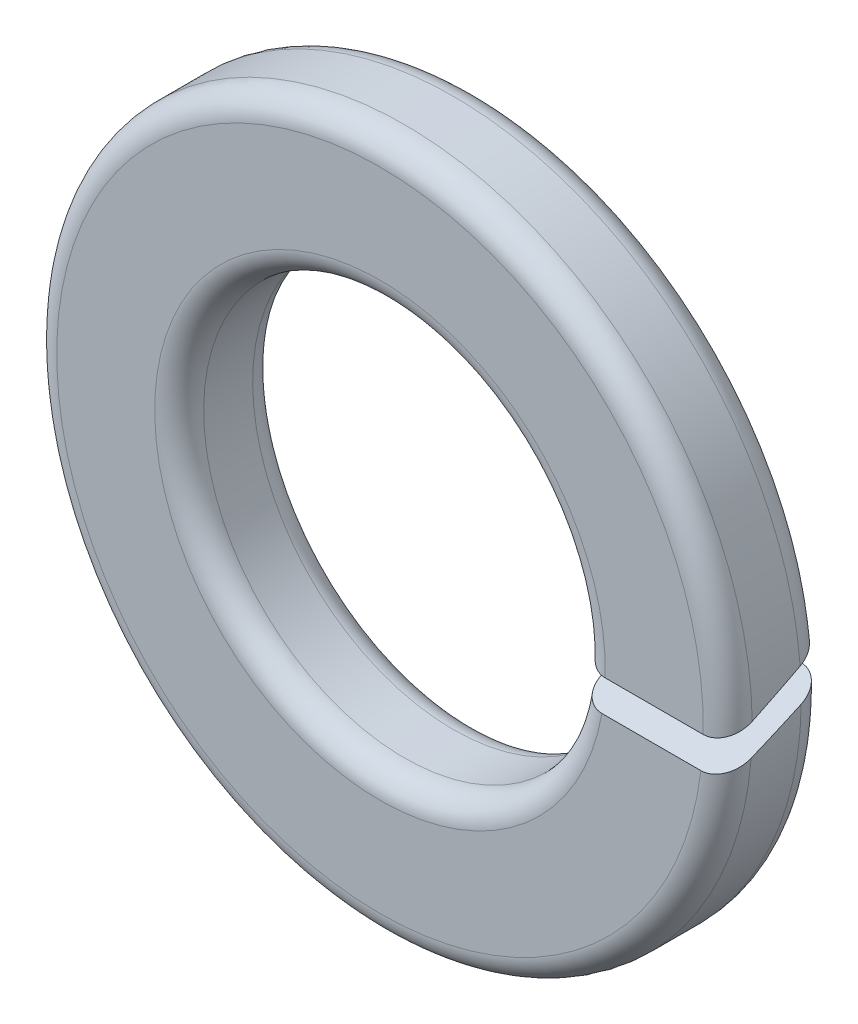
ISO-10303-21;
HEADER;
FILE_DESCRIPTION(('STEP AP214'),'2;1');
FILE_NAME('part.step','',(''),(''),'','','');
FILE_SCHEMA(('AUTOMOTIVE_DESIGN { 1 0 10303 214 1 1 1 1 }'));
ENDSEC;
DATA;
#1=APPLICATION_CONTEXT('core data for automotive mechanical design processes');
#2=APPLICATION_PROTOCOL_DEFINITION('international standard','automotive_design',2000,#1);
#3=PRODUCT_CONTEXT('',#1,'mechanical');
#4=PRODUCT('Part','Part','',(#3));
#5=PRODUCT_RELATED_PRODUCT_CATEGORY('part','',(#4));
#6=PRODUCT_DEFINITION_FORMATION('','',#4);
#7=PRODUCT_DEFINITION_CONTEXT('part definition',#1,'design');
#8=PRODUCT_DEFINITION('design','',#6,#7);
#9=PRODUCT_DEFINITION_SHAPE('','',#8);
#10=(LENGTH_UNIT() NAMED_UNIT(*) SI_UNIT(.MILLI.,.METRE.));
#11=(NAMED_UNIT(*) PLANE_ANGLE_UNIT() SI_UNIT($,.RADIAN.));
#12=(NAMED_UNIT(*) SI_UNIT($,.STERADIAN.) SOLID_ANGLE_UNIT());
#13=UNCERTAINTY_MEASURE_WITH_UNIT(LENGTH_MEASURE(1.E-05),#10,'distance_accuracy_value','');
#14=(GEOMETRIC_REPRESENTATION_CONTEXT(3) GLOBAL_UNCERTAINTY_ASSIGNED_CONTEXT((#13)) GLOBAL_UNIT_ASSIGNED_CONTEXT((#10,
#11,#12)) REPRESENTATION_CONTEXT('',''));
#15=CARTESIAN_POINT('',(0.,0.,0.));
#16=DIRECTION('',(0.,0.,1.));
#17=DIRECTION('',(1.,0.,0.));
#18=AXIS2_PLACEMENT_3D('',#15,#16,#17);
#19=CARTESIAN_POINT('',(0.,0.,2.));
#20=DIRECTION('',(0.,0.,1.));
#21=DIRECTION('',(1.,0.,0.));
#22=AXIS2_PLACEMENT_3D('',#19,#20,#21);
#23=PLANE('',#22);
#24=CARTESIAN_POINT('',(0.,0.,2.));
#25=DIRECTION('',(0.,0.,1.));
#26=DIRECTION('',(1.,0.,0.));
#27=AXIS2_PLACEMENT_3D('',#24,#25,#26);
#28=CIRCLE('',#27,4.6);
#29=CARTESIAN_POINT('',(4.53037296135653,-0.797321033843752,2.));
#30=VERTEX_POINT('',#29);
#31=CARTESIAN_POINT('',(4.5980099453059,-0.135294282466256,2.));
#32=VERTEX_POINT('',#31);
#33=EDGE_CURVE('E115',#30,#32,#28,.F.);
#34=ORIENTED_EDGE('',*,*,#33,.T.);
#35=DIRECTION('',(-1.,0.,0.));
#36=VECTOR('',#35,1.);
#37=CARTESIAN_POINT('',(7.1,-0.135294282466256,2.));
#38=LINE('',#37,#36);
#39=CARTESIAN_POINT('',(6.59861314649767,-0.135294282466256,2.));
#40=VERTEX_POINT('',#39);
#41=EDGE_CURVE('E198',#40,#32,#38,.T.);
#42=ORIENTED_EDGE('',*,*,#41,.F.);
#43=CARTESIAN_POINT('',(0.,0.,2.));
#44=DIRECTION('',(0.,0.,1.));
#45=DIRECTION('',(1.,0.,0.));
#46=AXIS2_PLACEMENT_3D('',#43,#44,#45);
#47=CIRCLE('',#46,6.6);
#48=CARTESIAN_POINT('',(6.5516623210446,-0.797321033843752,2.));
#49=VERTEX_POINT('',#48);
#50=EDGE_CURVE('E120',#40,#49,#47,.T.);
#51=ORIENTED_EDGE('',*,*,#50,.T.);
#52=DIRECTION('',(-1.,0.,0.));
#53=VECTOR('',#52,1.);
#54=CARTESIAN_POINT('',(7.1,-0.797321033843752,2.));
#55=LINE('',#54,#53);
#56=EDGE_CURVE('E112',#49,#30,#55,.T.);
#57=ORIENTED_EDGE('',*,*,#56,.T.);
#58=EDGE_LOOP('',(#34,#42,#51,#57));
#59=FACE_BOUND('',#58,.T.);
#60=ADVANCED_FACE('F30',(#59),#23,.T.);
#61=CARTESIAN_POINT('',(0.,0.,0.));
#62=DIRECTION('',(0.,0.,1.));
#63=DIRECTION('',(1.,0.,0.));
#64=AXIS2_PLACEMENT_3D('',#61,#62,#63);
#65=PLANE('',#64);
#66=DIRECTION('',(-1.,0.,0.));
#67=VECTOR('',#66,1.);
#68=CARTESIAN_POINT('',(7.1,0.797321033843752,0.));
#69=LINE('',#68,#67);
#70=CARTESIAN_POINT('',(6.5516623210442,0.797321033843752,0.));
#71=VERTEX_POINT('',#70);
#72=CARTESIAN_POINT('',(4.53037296135653,0.797321033843752,0.));
#73=VERTEX_POINT('',#72);
#74=EDGE_CURVE('E58',#71,#73,#69,.T.);
#75=ORIENTED_EDGE('',*,*,#74,.T.);
#76=CARTESIAN_POINT('',(0.,0.,0.));
#77=DIRECTION('',(0.,0.,1.));
#78=DIRECTION('',(1.,0.,0.));
#79=AXIS2_PLACEMENT_3D('',#76,#77,#78);
#80=CIRCLE('',#79,4.6);
#81=CARTESIAN_POINT('',(4.5980099453059,0.135294282466255,0.));
#82=VERTEX_POINT('',#81);
#83=EDGE_CURVE('E111',#73,#82,#80,.T.);
#84=ORIENTED_EDGE('',*,*,#83,.T.);
#85=DIRECTION('',(-1.,0.,0.));
#86=VECTOR('',#85,1.);
#87=CARTESIAN_POINT('',(7.1,0.135294282466255,0.));
#88=LINE('',#87,#86);
#89=CARTESIAN_POINT('',(6.59861314649808,0.135294282466255,0.));
#90=VERTEX_POINT('',#89);
#91=EDGE_CURVE('E98',#90,#82,#88,.T.);
#92=ORIENTED_EDGE('',*,*,#91,.F.);
#93=CARTESIAN_POINT('',(0.,0.,0.));
#94=DIRECTION('',(0.,0.,1.));
#95=DIRECTION('',(1.,0.,0.));
#96=AXIS2_PLACEMENT_3D('',#93,#94,#95);
#97=CIRCLE('',#96,6.6);
#98=EDGE_CURVE('E109',#90,#71,#97,.F.);
#99=ORIENTED_EDGE('',*,*,#98,.T.);
#100=EDGE_LOOP('',(#75,#84,#92,#99));
#101=FACE_BOUND('',#100,.T.);
#102=ADVANCED_FACE('F108',(#101),#65,.F.);
#103=CARTESIAN_POINT('',(0.,0.,2.));
#104=DIRECTION('',(0.,0.,-1.));
#105=DIRECTION('',(-1.,0.,0.));
#106=AXIS2_PLACEMENT_3D('',#103,#104,#105);
#107=CYLINDRICAL_SURFACE('',#106,7.1);
#108=CARTESIAN_POINT('',(0.,0.,1.70986047494574));
#109=DIRECTION('',(0.,-0.906307787036648,-0.422618261740704));
#110=DIRECTION('',(0.,0.422618261740704,-0.906307787036648));
#111=AXIS2_PLACEMENT_3D('',#108,#109,#110);
#112=ELLIPSE('',#111,16.8000312403826,7.1);
#113=CARTESIAN_POINT('',(7.07755009625974,0.56416720476625,0.5));
#114=VERTEX_POINT('',#113);
#115=CARTESIAN_POINT('',(7.09932556720264,0.0978595466112459,1.5));
#116=VERTEX_POINT('',#115);
#117=EDGE_CURVE('E214',#114,#116,#112,.T.);
#118=ORIENTED_EDGE('',*,*,#117,.F.);
#119=CARTESIAN_POINT('',(0.,0.,0.5));
#120=DIRECTION('',(0.,0.,1.));
#121=DIRECTION('',(1.,0.,0.));
#122=AXIS2_PLACEMENT_3D('',#119,#120,#121);
#123=CIRCLE('',#122,7.1);
#124=CARTESIAN_POINT('',(7.09932556720264,-0.0978595466112465,0.5));
#125=VERTEX_POINT('',#124);
#126=EDGE_CURVE('E117',#114,#125,#123,.T.);
#127=ORIENTED_EDGE('',*,*,#126,.T.);
#128=CARTESIAN_POINT('',(0.,0.,0.290139525054257));
#129=DIRECTION('',(0.,0.906307787036648,0.422618261740703));
#130=DIRECTION('',(0.,0.422618261740703,-0.906307787036648));
#131=AXIS2_PLACEMENT_3D('',#128,#129,#130);
#132=ELLIPSE('',#131,16.8000312403826,7.1);
#133=CARTESIAN_POINT('',(7.07755009625974,-0.56416720476625,1.5));
#134=VERTEX_POINT('',#133);
#135=EDGE_CURVE('E50',#134,#125,#132,.T.);
#136=ORIENTED_EDGE('',*,*,#135,.F.);
#137=CARTESIAN_POINT('',(0.,0.,1.5));
#138=DIRECTION('',(0.,0.,1.));
#139=DIRECTION('',(1.,0.,0.));
#140=AXIS2_PLACEMENT_3D('',#137,#138,#139);
#141=CIRCLE('',#140,7.1);
#142=EDGE_CURVE('E104',#134,#116,#141,.F.);
#143=ORIENTED_EDGE('',*,*,#142,.T.);
#144=EDGE_LOOP('',(#118,#127,#136,#143));
#145=FACE_BOUND('',#144,.T.);
#146=ADVANCED_FACE('F32',(#145),#107,.T.);
#147=CARTESIAN_POINT('',(0.,0.,2.));
#148=DIRECTION('',(0.,0.,-1.));
#149=DIRECTION('',(-1.,0.,0.));
#150=AXIS2_PLACEMENT_3D('',#147,#148,#149);
#151=CYLINDRICAL_SURFACE('',#150,4.1);
#152=CARTESIAN_POINT('',(0.,0.,0.5));
#153=DIRECTION('',(0.,0.,1.));
#154=DIRECTION('',(1.,0.,0.));
#155=AXIS2_PLACEMENT_3D('',#152,#153,#154);
#156=CIRCLE('',#155,4.1);
#157=CARTESIAN_POINT('',(4.09883196888297,-0.0978595466112465,0.5));
#158=VERTEX_POINT('',#157);
#159=CARTESIAN_POINT('',(4.06099930621346,0.56416720476625,0.5));
#160=VERTEX_POINT('',#159);
#161=EDGE_CURVE('E187',#158,#160,#156,.F.);
#162=ORIENTED_EDGE('',*,*,#161,.T.);
#163=CARTESIAN_POINT('',(0.,0.,1.70986047494574));
#164=DIRECTION('',(0.,-0.906307787036648,-0.422618261740704));
#165=DIRECTION('',(0.,0.422618261740704,-0.906307787036648));
#166=AXIS2_PLACEMENT_3D('',#163,#164,#165);
#167=ELLIPSE('',#166,9.70142649092515,4.1);
#168=CARTESIAN_POINT('',(4.09883196888297,0.097859546611246,1.5));
#169=VERTEX_POINT('',#168);
#170=EDGE_CURVE('E173',#160,#169,#167,.T.);
#171=ORIENTED_EDGE('',*,*,#170,.T.);
#172=CARTESIAN_POINT('',(0.,0.,1.5));
#173=DIRECTION('',(0.,0.,1.));
#174=DIRECTION('',(1.,0.,0.));
#175=AXIS2_PLACEMENT_3D('',#172,#173,#174);
#176=CIRCLE('',#175,4.1);
#177=CARTESIAN_POINT('',(4.06099930621346,-0.56416720476625,1.5));
#178=VERTEX_POINT('',#177);
#179=EDGE_CURVE('E190',#169,#178,#176,.T.);
#180=ORIENTED_EDGE('',*,*,#179,.T.);
#181=CARTESIAN_POINT('',(0.,0.,0.290139525054257));
#182=DIRECTION('',(0.,0.906307787036648,0.422618261740703));
#183=DIRECTION('',(0.,0.422618261740703,-0.906307787036648));
#184=AXIS2_PLACEMENT_3D('',#181,#182,#183);
#185=ELLIPSE('',#184,9.70142649092515,4.1);
#186=EDGE_CURVE('E153',#178,#158,#185,.T.);
#187=ORIENTED_EDGE('',*,*,#186,.T.);
#188=EDGE_LOOP('',(#162,#171,#180,#187));
#189=FACE_BOUND('',#188,.T.);
#190=ADVANCED_FACE('F212',(#189),#151,.F.);
#191=CARTESIAN_POINT('',(0.,0.,1.5));
#192=DIRECTION('',(0.,0.,1.));
#193=DIRECTION('',(1.,0.,0.));
#194=AXIS2_PLACEMENT_3D('',#191,#192,#193);
#195=TOROIDAL_SURFACE('',#194,4.6,0.5);
#196=ORIENTED_EDGE('',*,*,#179,.F.);
#197=CARTESIAN_POINT('',(4.09882978121524,0.0979528081428813,1.49979999999999));
#198=CARTESIAN_POINT('',(4.09916106101542,0.0834221734788947,1.53096104659631));
#199=CARTESIAN_POINT('',(4.10233636942206,0.0688958519928222,1.56211284355273));
#200=CARTESIAN_POINT('',(4.11434047193114,0.0402109132985989,1.62362789309689));
#201=CARTESIAN_POINT('',(4.12319069700712,0.0260539025814959,1.65398770055344));
#202=CARTESIAN_POINT('',(4.1465276820531,-0.00144128965423044,1.7129513305837));
#203=CARTESIAN_POINT('',(4.16102453296063,-0.0147779554695732,1.74155190272122));
#204=CARTESIAN_POINT('',(4.19548653906382,-0.0401104562074277,1.79587762586737));
#205=CARTESIAN_POINT('',(4.21544335596978,-0.052108296722425,1.82160707788295));
#206=CARTESIAN_POINT('',(4.25887505965479,-0.0734653488518066,1.86740742397609));
#207=CARTESIAN_POINT('',(4.28199909455598,-0.0829514906023585,1.88775052060908));
#208=CARTESIAN_POINT('',(4.33213593301265,-0.0998815567318869,1.92405716458854));
#209=CARTESIAN_POINT('',(4.35914714793745,-0.107326311800414,1.94002249335449));
#210=CARTESIAN_POINT('',(4.41280069472074,-0.119027681220165,1.96511616105459));
#211=CARTESIAN_POINT('',(4.439112257442,-0.123556403580497,1.97482803749739));
#212=CARTESIAN_POINT('',(4.49323489175623,-0.130483575926436,1.98968340653282));
#213=CARTESIAN_POINT('',(4.52104254118704,-0.132886685228442,1.99483689106171));
#214=CARTESIAN_POINT('',(4.5575832110603,-0.134565266980473,1.99843662124558));
#215=CARTESIAN_POINT('',(4.56609923649111,-0.13485321847712,1.99905413522291));
#216=CARTESIAN_POINT('',(4.58314253088512,-0.135224996847319,1.9998514165107));
#217=CARTESIAN_POINT('',(4.59166975992316,-0.135309150292392,2.00003188415604));
#218=CARTESIAN_POINT('',(4.6002,-0.135292047953621,1.99999520807219));
#219=B_SPLINE_CURVE_WITH_KNOTS('',3,(#197,#198,#199,#200,#201,#202,#203,#204,#205,#206,#207,
#208,#209,#210,#211,#212,#213,#214,#215,#216,#217,#218),.UNSPECIFIED.,.F.,.F.,(4,2,2,2,2,2,2,2,
2,2,4),(0.,0.103065957055956,0.206523447195199,0.310166678103214,0.41365250340955,
0.509783234975608,0.605874790376606,0.690656490343865,0.775251886057356,0.800872241381701,
0.826451514709323),.UNSPECIFIED.);
#220=EDGE_CURVE('E181',#169,#32,#219,.T.);
#221=ORIENTED_EDGE('',*,*,#220,.T.);
#222=ORIENTED_EDGE('',*,*,#33,.F.);
#223=CARTESIAN_POINT('',(4.60019999999999,-0.795128319515775,1.99529770894895));
#224=CARTESIAN_POINT('',(4.57471403644331,-0.796740859042683,1.998755811124));
#225=CARTESIAN_POINT('',(4.54889774794373,-0.797470015238,2.00031949163099));
#226=CARTESIAN_POINT('',(4.49732142253978,-0.797124272030473,1.99957804292973));
#227=CARTESIAN_POINT('',(4.47156142439269,-0.796048379974827,1.99727078497068));
#228=CARTESIAN_POINT('',(4.42079326291308,-0.792049380019405,1.98869490189116));
#229=CARTESIAN_POINT('',(4.39578671474482,-0.7891225637708,1.98241832419096));
#230=CARTESIAN_POINT('',(4.34737206684388,-0.781487050045984,1.96604391216645));
#231=CARTESIAN_POINT('',(4.32396250942414,-0.776780003911182,1.95594961915521));
#232=CARTESIAN_POINT('',(4.27999670274206,-0.765878105449054,1.93257042245649));
#233=CARTESIAN_POINT('',(4.25938196117996,-0.759725257125126,1.91937559664497));
#234=CARTESIAN_POINT('',(4.22081379381853,-0.746074374456363,1.89010118429075));
#235=CARTESIAN_POINT('',(4.20286151004175,-0.738575765897599,1.87402036634229));
#236=CARTESIAN_POINT('',(4.16957297407527,-0.72227764559821,1.83906893456895));
#237=CARTESIAN_POINT('',(4.15431324251066,-0.713450324362096,1.82013868308854));
#238=CARTESIAN_POINT('',(4.12718092469042,-0.694914093967582,1.78038760872735));
#239=CARTESIAN_POINT('',(4.11530915627278,-0.685204972691281,1.75956633095825));
#240=CARTESIAN_POINT('',(4.0940946631354,-0.664248539502294,1.71462511495528));
#241=CARTESIAN_POINT('',(4.08508176071187,-0.652941721072736,1.69037756458414));
#242=CARTESIAN_POINT('',(4.07113477162721,-0.629893493972557,1.64095048206234));
#243=CARTESIAN_POINT('',(4.06620164345808,-0.618151983853101,1.61577073235393));
#244=CARTESIAN_POINT('',(4.05975361335087,-0.592296502067095,1.56032347273073));
#245=CARTESIAN_POINT('',(4.05904022925624,-0.578145594692515,1.52997675393446));
#246=CARTESIAN_POINT('',(4.06101230170062,-0.564073943234621,1.4998));
#247=B_SPLINE_CURVE_WITH_KNOTS('',3,(#223,#224,#225,#226,#227,#228,#229,#230,#231,#232,#233,
#234,#235,#236,#237,#238,#239,#240,#241,#242,#243,#244,#245,#246),.UNSPECIFIED.,.F.,.F.,(4,2,2,
2,2,2,2,2,2,2,2,4),(0.,0.0772539711700862,0.15455044065573,0.232002267308011,0.309382425149111,
0.384744488684913,0.460138784766065,0.537415784840683,0.614711423462317,0.699063515762487,
0.78343541990806,0.88342110903194),.UNSPECIFIED.);
#248=EDGE_CURVE('E209',#30,#178,#247,.T.);
#249=ORIENTED_EDGE('',*,*,#248,.T.);
#250=EDGE_LOOP('',(#196,#221,#222,#249));
#251=FACE_BOUND('',#250,.T.);
#252=ADVANCED_FACE('F159',(#251),#195,.T.);
#253=CARTESIAN_POINT('',(0.,0.,0.5));
#254=DIRECTION('',(0.,0.,1.));
#255=DIRECTION('',(1.,0.,0.));
#256=AXIS2_PLACEMENT_3D('',#253,#254,#255);
#257=TOROIDAL_SURFACE('',#256,4.6,0.5);
#258=ORIENTED_EDGE('',*,*,#83,.F.);
#259=CARTESIAN_POINT('',(4.60019999999999,0.795128319515775,0.00470229105104701));
#260=CARTESIAN_POINT('',(4.57471403644331,0.796740859042683,0.00124418887599843));
#261=CARTESIAN_POINT('',(4.54889774794373,0.797470015238,-0.0003194916309916));
#262=CARTESIAN_POINT('',(4.49732142253978,0.797124272030473,0.000421957070269702));
#263=CARTESIAN_POINT('',(4.47156142439269,0.796048379974827,0.00272921502932344));
#264=CARTESIAN_POINT('',(4.42079326291308,0.792049380019405,0.0113050981088438));
#265=CARTESIAN_POINT('',(4.39578671474482,0.7891225637708,0.0175816758090363));
#266=CARTESIAN_POINT('',(4.34737206684388,0.781487050045984,0.0339560878335507));
#267=CARTESIAN_POINT('',(4.32396250942414,0.776780003911182,0.0440503808447902));
#268=CARTESIAN_POINT('',(4.27999670274206,0.765878105449055,0.0674295775435152));
#269=CARTESIAN_POINT('',(4.25938196117996,0.759725257125126,0.080624403355026));
#270=CARTESIAN_POINT('',(4.22081379381853,0.746074374456363,0.109898815709252));
#271=CARTESIAN_POINT('',(4.20286151004175,0.7385757658976,0.125979633657711));
#272=CARTESIAN_POINT('',(4.16957297407527,0.72227764559821,0.16093106543105));
#273=CARTESIAN_POINT('',(4.15431324251066,0.713450324362096,0.179861316911457));
#274=CARTESIAN_POINT('',(4.12718092469042,0.694914093967582,0.219612391272651));
#275=CARTESIAN_POINT('',(4.11530915627278,0.685204972691281,0.240433669041746));
#276=CARTESIAN_POINT('',(4.0940946631354,0.664248539502294,0.285374885044723));
#277=CARTESIAN_POINT('',(4.08508176071187,0.652941721072736,0.309622435415855));
#278=CARTESIAN_POINT('',(4.07113477162721,0.629893493972557,0.359049517937664));
#279=CARTESIAN_POINT('',(4.06620164345808,0.618151983853101,0.38422926764607));
#280=CARTESIAN_POINT('',(4.05975361335087,0.592296502067095,0.439676527269268));
#281=CARTESIAN_POINT('',(4.05904022925624,0.578145594692515,0.470023246065544));
#282=CARTESIAN_POINT('',(4.06101230170062,0.564073943234621,0.500199999999996));
#283=B_SPLINE_CURVE_WITH_KNOTS('',3,(#259,#260,#261,#262,#263,#264,#265,#266,#267,#268,#269,
#270,#271,#272,#273,#274,#275,#276,#277,#278,#279,#280,#281,#282),.UNSPECIFIED.,.F.,.F.,(4,2,2,
2,2,2,2,2,2,2,2,4),(0.,0.0772539711700862,0.15455044065573,0.232002267308011,0.309382425149111,
0.384744488684913,0.460138784766065,0.537415784840683,0.614711423462317,0.699063515762487,
0.78343541990806,0.883421109031941),.UNSPECIFIED.);
#284=EDGE_CURVE('E166',#73,#160,#283,.T.);
#285=ORIENTED_EDGE('',*,*,#284,.T.);
#286=ORIENTED_EDGE('',*,*,#161,.F.);
#287=CARTESIAN_POINT('',(4.09882978121524,-0.0979528081428819,0.500200000000009));
#288=CARTESIAN_POINT('',(4.09916106101542,-0.0834221734788953,0.469038953403694));
#289=CARTESIAN_POINT('',(4.10233636942206,-0.0688958519928227,0.437887156447265));
#290=CARTESIAN_POINT('',(4.11434047193114,-0.0402109132985995,0.376372106903112));
#291=CARTESIAN_POINT('',(4.12319069700712,-0.0260539025814966,0.346012299446557));
#292=CARTESIAN_POINT('',(4.1465276820531,0.00144128965422973,0.287048669416302));
#293=CARTESIAN_POINT('',(4.16102453296063,0.0147779554695726,0.258448097278776));
#294=CARTESIAN_POINT('',(4.19548653906382,0.0401104562074271,0.204122374132634));
#295=CARTESIAN_POINT('',(4.21544335596979,0.0521082967224244,0.178392922117053));
#296=CARTESIAN_POINT('',(4.25887505965479,0.0734653488518059,0.132592576023911));
#297=CARTESIAN_POINT('',(4.28199909455598,0.082951490602358,0.112249479390918));
#298=CARTESIAN_POINT('',(4.33213593301265,0.0998815567318865,0.0759428354114603));
#299=CARTESIAN_POINT('',(4.35914714793745,0.107326311800413,0.0599775066455064));
#300=CARTESIAN_POINT('',(4.41280069472074,0.119027681220164,0.0348838389454119));
#301=CARTESIAN_POINT('',(4.439112257442,0.123556403580497,0.0251719625026127));
#302=CARTESIAN_POINT('',(4.49323489175624,0.130483575926436,0.0103165934671837));
#303=CARTESIAN_POINT('',(4.52104254118705,0.132886685228442,0.00516310893829089));
#304=CARTESIAN_POINT('',(4.5575832110603,0.134565266980473,0.00156337875441968));
#305=CARTESIAN_POINT('',(4.56609923649112,0.134853218477119,0.000945864777089778));
#306=CARTESIAN_POINT('',(4.58314253088512,0.135224996847318,0.000148583489302272));
#307=CARTESIAN_POINT('',(4.59166975992316,0.135309150292392,-3.18841560424285E-05));
#308=CARTESIAN_POINT('',(4.6002,0.135292047953621,4.79192780918082E-06));
#309=B_SPLINE_CURVE_WITH_KNOTS('',3,(#287,#288,#289,#290,#291,#292,#293,#294,#295,#296,#297,
#298,#299,#300,#301,#302,#303,#304,#305,#306,#307,#308),.UNSPECIFIED.,.F.,.F.,(4,2,2,2,2,2,2,2,
2,2,4),(0.,0.103065957055956,0.206523447195199,0.310166678103215,0.413652503409551,
0.509783234975608,0.605874790376607,0.690656490343867,0.775251886057358,0.800872241381703,
0.826451514709323),.UNSPECIFIED.);
#310=EDGE_CURVE('E147',#158,#82,#309,.T.);
#311=ORIENTED_EDGE('',*,*,#310,.T.);
#312=EDGE_LOOP('',(#258,#285,#286,#311));
#313=FACE_BOUND('',#312,.T.);
#314=ADVANCED_FACE('F154',(#313),#257,.T.);
#315=CARTESIAN_POINT('',(0.,0.,1.5));
#316=DIRECTION('',(0.,0.,1.));
#317=DIRECTION('',(1.,0.,0.));
#318=AXIS2_PLACEMENT_3D('',#315,#316,#317);
#319=TOROIDAL_SURFACE('',#318,6.6,0.5);
#320=ORIENTED_EDGE('',*,*,#50,.F.);
#321=CARTESIAN_POINT('',(6.0992135341679,0.0979528081428769,1.4998));
#322=CARTESIAN_POINT('',(6.0994261256204,0.0835423445008273,1.53070333900813));
#323=CARTESIAN_POINT('',(6.10246638454821,0.06913290458314,1.56160448263227));
#324=CARTESIAN_POINT('',(6.11415744393571,0.0406770925398191,1.62262816848789));
#325=CARTESIAN_POINT('',(6.12282727986894,0.0266321209870841,1.65274770718109));
#326=CARTESIAN_POINT('',(6.14574954223975,-0.000652925882841008,1.71126067902007));
#327=CARTESIAN_POINT('',(6.16001125764802,-0.0138916193526956,1.73965114878468));
#328=CARTESIAN_POINT('',(6.19393282877224,-0.0390591420761006,1.79362307543711));
#329=CARTESIAN_POINT('',(6.21358543702887,-0.0509897000436021,1.81920823956395));
#330=CARTESIAN_POINT('',(6.25648535484974,-0.0723279718572521,1.86496831114004));
#331=CARTESIAN_POINT('',(6.27941445555665,-0.0818495034242601,1.88538730147934));
#332=CARTESIAN_POINT('',(6.32914513625177,-0.0988802363704536,1.9219098261438));
#333=CARTESIAN_POINT('',(6.35594423872936,-0.106390716477301,1.93801610270928));
#334=CARTESIAN_POINT('',(6.40938945596758,-0.118289807040295,1.96353378476939));
#335=CARTESIAN_POINT('',(6.43571807037469,-0.122933477245029,1.97349216766001));
#336=CARTESIAN_POINT('',(6.48994506564292,-0.130092382607962,1.98884448975409));
#337=CARTESIAN_POINT('',(6.51784240685284,-0.132609010108606,1.99424141484557));
#338=CARTESIAN_POINT('',(6.57190069182223,-0.135277806914471,1.99996466806518));
#339=CARTESIAN_POINT('',(6.59801292495992,-0.135609323159519,2.00067560694694));
#340=CARTESIAN_POINT('',(6.64998300589876,-0.13437842926597,1.99803594647382));
#341=CARTESIAN_POINT('',(6.6758408898721,-0.132816292476355,1.9946859333177));
#342=CARTESIAN_POINT('',(6.72612087162153,-0.127917847370385,1.98418118388822));
#343=CARTESIAN_POINT('',(6.75056002513043,-0.124612550459928,1.9770929517894));
#344=CARTESIAN_POINT('',(6.79785804717839,-0.116384031311683,1.95944683553044));
#345=CARTESIAN_POINT('',(6.82071668968806,-0.111460578237721,1.94888845634053));
#346=CARTESIAN_POINT('',(6.86526664873872,-0.0999343924501524,1.92417047115201));
#347=CARTESIAN_POINT('',(6.88686750753616,-0.0932693628073892,1.9098772689577));
#348=CARTESIAN_POINT('',(6.92735138370558,-0.0786029758715741,1.87842510067498));
#349=CARTESIAN_POINT('',(6.94623376538282,-0.0706013069577661,1.86126546631369));
#350=CARTESIAN_POINT('',(6.98228336675705,-0.0528429795971389,1.82318261039215));
#351=CARTESIAN_POINT('',(6.99920949263842,-0.0429989639289677,1.80207205066615));
#352=CARTESIAN_POINT('',(7.02926546232474,-0.0223214728436793,1.75772902793498));
#353=CARTESIAN_POINT('',(7.04239264754366,-0.0114873114431315,1.73449509383359));
#354=CARTESIAN_POINT('',(7.06558946650214,0.0118166249911589,1.68451964087514));
#355=CARTESIAN_POINT('',(7.07531519642495,0.0243475289035445,1.65764703071479));
#356=CARTESIAN_POINT('',(7.08995651380683,0.0498852292847494,1.60288125551339));
#357=CARTESIAN_POINT('',(7.09487802801906,0.0628914188014387,1.57498939208539));
#358=CARTESIAN_POINT('',(7.09878730379495,0.0832859275241289,1.53125322698919));
#359=CARTESIAN_POINT('',(7.09943466674425,0.0906224270417427,1.51552005300135));
#360=CARTESIAN_POINT('',(7.09932424103709,0.0979528081428771,1.4998));
#361=B_SPLINE_CURVE_WITH_KNOTS('',3,(#321,#322,#323,#324,#325,#326,#327,#328,#329,#330,#331,
#332,#333,#334,#335,#336,#337,#338,#339,#340,#341,#342,#343,#344,#345,#346,#347,#348,#349,#350,
#351,#352,#353,#354,#355,#356,#357,#358,#359,#360),.UNSPECIFIED.,.F.,.F.,(4,2,2,2,2,2,2,2,2,2,2,
2,2,2,2,2,2,2,2,4),(0.,0.10220755799285,0.204762526196671,0.307488580668952,0.410077202501871,
0.505972210085335,0.601806097221115,0.686931731965967,0.772001601007595,0.849991701739418,
0.927970545933792,1.00460672435748,1.08125383997413,1.16114755361873,1.24105991954759,
1.3270748058857,1.41314974265387,1.50636386650156,1.59946285023943,1.65150766735801),.UNSPECIFIED.);
#362=EDGE_CURVE('E174',#40,#116,#361,.T.);
#363=ORIENTED_EDGE('',*,*,#362,.T.);
#364=ORIENTED_EDGE('',*,*,#142,.F.);
#365=CARTESIAN_POINT('',(7.07755748959793,-0.564073943234619,1.4998));
#366=CARTESIAN_POINT('',(7.07644556891722,-0.578349970282248,1.53041503880102));
#367=CARTESIAN_POINT('',(7.07244676749071,-0.59258214569801,1.56093603747403));
#368=CARTESIAN_POINT('',(7.05889038146412,-0.62057695138239,1.6209710920025));
#369=CARTESIAN_POINT('',(7.04932866258406,-0.634339224364342,1.65048438165424));
#370=CARTESIAN_POINT('',(7.02485702786549,-0.660997265855039,1.70765273611827));
#371=CARTESIAN_POINT('',(7.00994418594385,-0.673892555693232,1.73530677441825));
#372=CARTESIAN_POINT('',(6.97510449578316,-0.698408784292213,1.78788199631356));
#373=CARTESIAN_POINT('',(6.95517969541846,-0.710030240760501,1.8128042901362));
#374=CARTESIAN_POINT('',(6.91125035836906,-0.731358386182405,1.85854264559511));
#375=CARTESIAN_POINT('',(6.88734589267341,-0.741101765532588,1.87943739004073));
#376=CARTESIAN_POINT('',(6.83573569165174,-0.758595216300016,1.91695221627507));
#377=CARTESIAN_POINT('',(6.80803097116546,-0.766345818295851,1.93357343589325));
#378=CARTESIAN_POINT('',(6.75177236183896,-0.778983876138662,1.96067583839896));
#379=CARTESIAN_POINT('',(6.72343136888456,-0.784040187223144,1.97151913251188));
#380=CARTESIAN_POINT('',(6.66501469834799,-0.791831038304202,1.98822666657187));
#381=CARTESIAN_POINT('',(6.63494038957222,-0.794567384267489,1.99409477942704));
#382=CARTESIAN_POINT('',(6.57700786770714,-0.797373814615211,2.00011318872966));
#383=CARTESIAN_POINT('',(6.54921155236116,-0.797673113976136,2.00075503828047));
#384=CARTESIAN_POINT('',(6.49395440248247,-0.796133954058602,1.99745429918555));
#385=CARTESIAN_POINT('',(6.46649339984043,-0.794296614531761,1.99351411185491));
#386=CARTESIAN_POINT('',(6.4147492068254,-0.788726319516922,1.98156857564631));
#387=CARTESIAN_POINT('',(6.39037876550522,-0.785137043380854,1.97387134813289));
#388=CARTESIAN_POINT('',(6.34343937115754,-0.776261170517862,1.95483697735264));
#389=CARTESIAN_POINT('',(6.32087021144814,-0.770974768872408,1.94350025243937));
#390=CARTESIAN_POINT('',(6.27834385697923,-0.758952108174331,1.91771757336941));
#391=CARTESIAN_POINT('',(6.25836297521207,-0.752230749958239,1.90330357415978));
#392=CARTESIAN_POINT('',(6.22118238477753,-0.737535304519451,1.87178908971633));
#393=CARTESIAN_POINT('',(6.20398305253941,-0.729561048028466,1.85468824148549));
#394=CARTESIAN_POINT('',(6.17176188148296,-0.712125714789739,1.81729804869365));
#395=CARTESIAN_POINT('',(6.15691789056477,-0.702606100610048,1.79688317020472));
#396=CARTESIAN_POINT('',(6.13081734082201,-0.682724265939049,1.75424643816034));
#397=CARTESIAN_POINT('',(6.11956313219207,-0.672361498992332,1.73202341272748));
#398=CARTESIAN_POINT('',(6.09974424244586,-0.649974051806225,1.68401337730433));
#399=CARTESIAN_POINT('',(6.09157074949547,-0.637887649581357,1.65809400408904));
#400=CARTESIAN_POINT('',(6.07963925656902,-0.613345106016099,1.60546234956643));
#401=CARTESIAN_POINT('',(6.0758779217336,-0.600889251231263,1.57875068277949));
#402=CARTESIAN_POINT('',(6.07323580652546,-0.580289411312935,1.53457418351325));
#403=CARTESIAN_POINT('',(6.07310286881935,-0.57217147083067,1.51716520396875));
#404=CARTESIAN_POINT('',(6.07386376819268,-0.564073943234619,1.4998));
#405=B_SPLINE_CURVE_WITH_KNOTS('',3,(#365,#366,#367,#368,#369,#370,#371,#372,#373,#374,#375,
#376,#377,#378,#379,#380,#381,#382,#383,#384,#385,#386,#387,#388,#389,#390,#391,#392,#393,#394,
#395,#396,#397,#398,#399,#400,#401,#402,#403,#404),.UNSPECIFIED.,.F.,.F.,(4,2,2,2,2,2,2,2,2,2,2,
2,2,2,2,2,2,2,2,4),(0.,0.101264541858403,0.202604438373451,0.303999833888533,0.405353866591863,
0.504464352083848,0.603548421938348,0.695333436849766,0.787046936343224,0.870021337165963,
0.952952273056531,1.03000170467303,1.10704228276773,1.18331871568324,1.25960546252544,
1.34020083608069,1.42084886683473,1.5097192363831,1.59852239130966,1.65605702532513),.UNSPECIFIED.);
#406=EDGE_CURVE('E141',#134,#49,#405,.T.);
#407=ORIENTED_EDGE('',*,*,#406,.T.);
#408=EDGE_LOOP('',(#320,#363,#364,#407));
#409=FACE_BOUND('',#408,.T.);
#410=ADVANCED_FACE('F158',(#409),#319,.T.);
#411=CARTESIAN_POINT('',(0.,0.,0.5));
#412=DIRECTION('',(0.,0.,1.));
#413=DIRECTION('',(1.,0.,0.));
#414=AXIS2_PLACEMENT_3D('',#411,#412,#413);
#415=TOROIDAL_SURFACE('',#414,6.6,0.5);
#416=ORIENTED_EDGE('',*,*,#126,.F.);
#417=CARTESIAN_POINT('',(7.07755748959793,0.564073943234619,0.5002));
#418=CARTESIAN_POINT('',(7.07644556891722,0.578349970282248,0.46958496119898));
#419=CARTESIAN_POINT('',(7.07244676749071,0.59258214569801,0.439063962525973));
#420=CARTESIAN_POINT('',(7.05889038146412,0.62057695138239,0.379028907997499));
#421=CARTESIAN_POINT('',(7.04932866258406,0.634339224364342,0.349515618345762));
#422=CARTESIAN_POINT('',(7.02485702786549,0.660997265855039,0.292347263881732));
#423=CARTESIAN_POINT('',(7.00994418594385,0.673892555693232,0.264693225581751));
#424=CARTESIAN_POINT('',(6.97510449578316,0.698408784292213,0.212118003686442));
#425=CARTESIAN_POINT('',(6.95517969541846,0.710030240760501,0.187195709863798));
#426=CARTESIAN_POINT('',(6.91125035836906,0.731358386182405,0.141457354404892));
#427=CARTESIAN_POINT('',(6.88734589267341,0.741101765532588,0.120562609959275));
#428=CARTESIAN_POINT('',(6.83573569165174,0.758595216300016,0.0830477837249316));
#429=CARTESIAN_POINT('',(6.80803097116546,0.766345818295851,0.0664265641067481));
#430=CARTESIAN_POINT('',(6.75177236183896,0.778983876138662,0.0393241616010399));
#431=CARTESIAN_POINT('',(6.72343136888456,0.784040187223144,0.0284808674881214));
#432=CARTESIAN_POINT('',(6.66501469834799,0.791831038304202,0.0117733334281331));
#433=CARTESIAN_POINT('',(6.63494038957222,0.794567384267489,0.00590522057295543));
#434=CARTESIAN_POINT('',(6.57700786770714,0.797373814615211,-0.000113188729662411));
#435=CARTESIAN_POINT('',(6.54921155236116,0.797673113976136,-0.0007550382804705));
#436=CARTESIAN_POINT('',(6.49395440248247,0.796133954058602,0.0025457008144529));
#437=CARTESIAN_POINT('',(6.46649339984043,0.794296614531761,0.00648588814508788));
#438=CARTESIAN_POINT('',(6.4147492068254,0.788726319516922,0.0184314243536907));
#439=CARTESIAN_POINT('',(6.39037876550522,0.785137043380854,0.0261286518671078));
#440=CARTESIAN_POINT('',(6.34343937115754,0.776261170517862,0.0451630226473556));
#441=CARTESIAN_POINT('',(6.32087021144814,0.770974768872408,0.056499747560625));
#442=CARTESIAN_POINT('',(6.27834385697923,0.758952108174331,0.0822824266305905));
#443=CARTESIAN_POINT('',(6.25836297521207,0.752230749958239,0.0966964258402237));
#444=CARTESIAN_POINT('',(6.22118238477753,0.737535304519451,0.128210910283674));
#445=CARTESIAN_POINT('',(6.20398305253941,0.729561048028466,0.14531175851451));
#446=CARTESIAN_POINT('',(6.17176188148296,0.712125714789739,0.182701951306349));
#447=CARTESIAN_POINT('',(6.15691789056477,0.702606100610048,0.203116829795278));
#448=CARTESIAN_POINT('',(6.13081734082201,0.682724265939049,0.24575356183966));
#449=CARTESIAN_POINT('',(6.11956313219207,0.672361498992332,0.267976587272524));
#450=CARTESIAN_POINT('',(6.09974424244586,0.649974051806225,0.315986622695672));
#451=CARTESIAN_POINT('',(6.09157074949547,0.637887649581357,0.341905995910963));
#452=CARTESIAN_POINT('',(6.07963925656902,0.613345106016099,0.394537650433566));
#453=CARTESIAN_POINT('',(6.0758779217336,0.600889251231263,0.421249317220508));
#454=CARTESIAN_POINT('',(6.07323580652546,0.580289411312935,0.46542581648675));
#455=CARTESIAN_POINT('',(6.07310286881935,0.57217147083067,0.482834796031252));
#456=CARTESIAN_POINT('',(6.07386376819268,0.564073943234619,0.5002));
#457=B_SPLINE_CURVE_WITH_KNOTS('',3,(#417,#418,#419,#420,#421,#422,#423,#424,#425,#426,#427,
#428,#429,#430,#431,#432,#433,#434,#435,#436,#437,#438,#439,#440,#441,#442,#443,#444,#445,#446,
#447,#448,#449,#450,#451,#452,#453,#454,#455,#456),.UNSPECIFIED.,.F.,.F.,(4,2,2,2,2,2,2,2,2,2,2,
2,2,2,2,2,2,2,2,4),(0.,0.101264541858403,0.202604438373451,0.303999833888533,0.405353866591863,
0.504464352083848,0.603548421938348,0.695333436849765,0.787046936343223,0.870021337165963,
0.952952273056531,1.03000170467303,1.10704228276773,1.18331871568324,1.25960546252544,
1.34020083608069,1.42084886683473,1.5097192363831,1.59852239130966,1.65605702532513),.UNSPECIFIED.);
#458=EDGE_CURVE('E12',#114,#71,#457,.T.);
#459=ORIENTED_EDGE('',*,*,#458,.T.);
#460=ORIENTED_EDGE('',*,*,#98,.F.);
#461=CARTESIAN_POINT('',(6.0992135341679,-0.0979528081428775,0.5002));
#462=CARTESIAN_POINT('',(6.0994261256204,-0.0835423445008277,0.469296660991873));
#463=CARTESIAN_POINT('',(6.10246638454821,-0.0691329045831405,0.438395517367727));
#464=CARTESIAN_POINT('',(6.11415744393571,-0.0406770925398197,0.377371831512107));
#465=CARTESIAN_POINT('',(6.12282727986894,-0.0266321209870848,0.347252292818907));
#466=CARTESIAN_POINT('',(6.14574954223975,0.000652925882840178,0.288739320979926));
#467=CARTESIAN_POINT('',(6.16001125764802,0.0138916193526948,0.260348851215318));
#468=CARTESIAN_POINT('',(6.19393282877224,0.0390591420760998,0.206376924562895));
#469=CARTESIAN_POINT('',(6.21358543702887,0.0509897000436014,0.180791760436048));
#470=CARTESIAN_POINT('',(6.25648535484974,0.0723279718572511,0.135031688859963));
#471=CARTESIAN_POINT('',(6.27941445555665,0.0818495034242588,0.114612698520665));
#472=CARTESIAN_POINT('',(6.32914513625177,0.0988802363704524,0.0780901738562027));
#473=CARTESIAN_POINT('',(6.35594423872936,0.106390716477301,0.0619838972907177));
#474=CARTESIAN_POINT('',(6.40938945596758,0.118289807040295,0.036466215230607));
#475=CARTESIAN_POINT('',(6.43571807037469,0.122933477245028,0.0265078323399928));
#476=CARTESIAN_POINT('',(6.48994506564292,0.130092382607961,0.0111555102459097));
#477=CARTESIAN_POINT('',(6.51784240685284,0.132609010108606,0.00575858515443299));
#478=CARTESIAN_POINT('',(6.57190069182223,0.13527780691447,3.53319348232406E-05));
#479=CARTESIAN_POINT('',(6.59801292495992,0.135609323159518,-0.000675606946943604));
#480=CARTESIAN_POINT('',(6.64998300589876,0.134378429265969,0.00196405352618427));
#481=CARTESIAN_POINT('',(6.6758408898721,0.132816292476355,0.00531406668229513));
#482=CARTESIAN_POINT('',(6.72612087162153,0.127917847370385,0.0158188161117844));
#483=CARTESIAN_POINT('',(6.75056002513043,0.124612550459927,0.0229070482105987));
#484=CARTESIAN_POINT('',(6.79785804717839,0.116384031311682,0.0405531644695554));
#485=CARTESIAN_POINT('',(6.82071668968806,0.11146057823772,0.0511115436594707));
#486=CARTESIAN_POINT('',(6.86526664873872,0.0999343924501517,0.0758295288479903));
#487=CARTESIAN_POINT('',(6.88686750753615,0.0932693628073885,0.0901227310422973));
#488=CARTESIAN_POINT('',(6.92735138370558,0.0786029758715735,0.121574899325023));
#489=CARTESIAN_POINT('',(6.94623376538282,0.0706013069577657,0.13873453368631));
#490=CARTESIAN_POINT('',(6.98228336675705,0.0528429795971384,0.176817389607849));
#491=CARTESIAN_POINT('',(6.99920949263842,0.0429989639289671,0.197927949333847));
#492=CARTESIAN_POINT('',(7.02926546232474,0.0223214728436785,0.242270972065022));
#493=CARTESIAN_POINT('',(7.04239264754366,0.0114873114431306,0.265504906166415));
#494=CARTESIAN_POINT('',(7.06558946650214,-0.0118166249911599,0.315480359124865));
#495=CARTESIAN_POINT('',(7.07531519642496,-0.0243475289035455,0.342352969285216));
#496=CARTESIAN_POINT('',(7.08995651380683,-0.0498852292847502,0.397118744486608));
#497=CARTESIAN_POINT('',(7.09487802801906,-0.0628914188014393,0.425010607914606));
#498=CARTESIAN_POINT('',(7.09878730379495,-0.0832859275241294,0.468746773010807));
#499=CARTESIAN_POINT('',(7.09943466674425,-0.0906224270417432,0.484479946998645));
#500=CARTESIAN_POINT('',(7.09932424103709,-0.0979528081428776,0.5002));
#501=B_SPLINE_CURVE_WITH_KNOTS('',3,(#461,#462,#463,#464,#465,#466,#467,#468,#469,#470,#471,
#472,#473,#474,#475,#476,#477,#478,#479,#480,#481,#482,#483,#484,#485,#486,#487,#488,#489,#490,
#491,#492,#493,#494,#495,#496,#497,#498,#499,#500),.UNSPECIFIED.,.F.,.F.,(4,2,2,2,2,2,2,2,2,2,2,
2,2,2,2,2,2,2,2,4),(0.,0.10220755799285,0.204762526196671,0.307488580668951,0.41007720250187,
0.505972210085334,0.601806097221115,0.686931731965967,0.772001601007596,0.849991701739418,
0.927970545933792,1.00460672435748,1.08125383997413,1.16114755361873,1.24105991954759,
1.3270748058857,1.41314974265387,1.50636386650156,1.59946285023943,1.65150766735801),.UNSPECIFIED.);
#502=EDGE_CURVE('E43',#90,#125,#501,.T.);
#503=ORIENTED_EDGE('',*,*,#502,.T.);
#504=EDGE_LOOP('',(#416,#459,#460,#503));
#505=FACE_BOUND('',#504,.T.);
#506=ADVANCED_FACE('F114',(#505),#415,.T.);
#507=CARTESIAN_POINT('',(7.1,0.135294282466255,0.));
#508=DIRECTION('',(0.,0.906307787036648,0.422618261740703));
#509=DIRECTION('',(0.,-0.422618261740703,0.906307787036648));
#510=AXIS2_PLACEMENT_3D('',#507,#508,#509);
#511=PLANE('',#510);
#512=ORIENTED_EDGE('',*,*,#56,.F.);
#513=ORIENTED_EDGE('',*,*,#406,.F.);
#514=ORIENTED_EDGE('',*,*,#135,.T.);
#515=ORIENTED_EDGE('',*,*,#502,.F.);
#516=ORIENTED_EDGE('',*,*,#91,.T.);
#517=ORIENTED_EDGE('',*,*,#310,.F.);
#518=ORIENTED_EDGE('',*,*,#186,.F.);
#519=ORIENTED_EDGE('',*,*,#248,.F.);
#520=EDGE_LOOP('',(#512,#513,#514,#515,#516,#517,#518,#519));
#521=FACE_BOUND('',#520,.T.);
#522=ADVANCED_FACE('F97',(#521),#511,.T.);
#523=CARTESIAN_POINT('',(7.1,0.797321033843752,0.));
#524=DIRECTION('',(0.,-0.906307787036648,-0.422618261740704));
#525=DIRECTION('',(0.,0.422618261740704,-0.906307787036648));
#526=AXIS2_PLACEMENT_3D('',#523,#524,#525);
#527=PLANE('',#526);
#528=ORIENTED_EDGE('',*,*,#170,.F.);
#529=ORIENTED_EDGE('',*,*,#284,.F.);
#530=ORIENTED_EDGE('',*,*,#74,.F.);
#531=ORIENTED_EDGE('',*,*,#458,.F.);
#532=ORIENTED_EDGE('',*,*,#117,.T.);
#533=ORIENTED_EDGE('',*,*,#362,.F.);
#534=ORIENTED_EDGE('',*,*,#41,.T.);
#535=ORIENTED_EDGE('',*,*,#220,.F.);
#536=EDGE_LOOP('',(#528,#529,#530,#531,#532,#533,#534,#535));
#537=FACE_BOUND('',#536,.T.);
#538=ADVANCED_FACE('F134',(#537),#527,.T.);
#539=CLOSED_SHELL('',(#60,#102,#146,#190,#252,#314,#410,#506,#522,#538));
#540=MANIFOLD_SOLID_BREP('B2',#539);
#541=ADVANCED_BREP_SHAPE_REPRESENTATION('',(#18,#540),#14);
#542=SHAPE_DEFINITION_REPRESENTATION(#9,#541);
ENDSEC;
END-ISO-10303-21;
